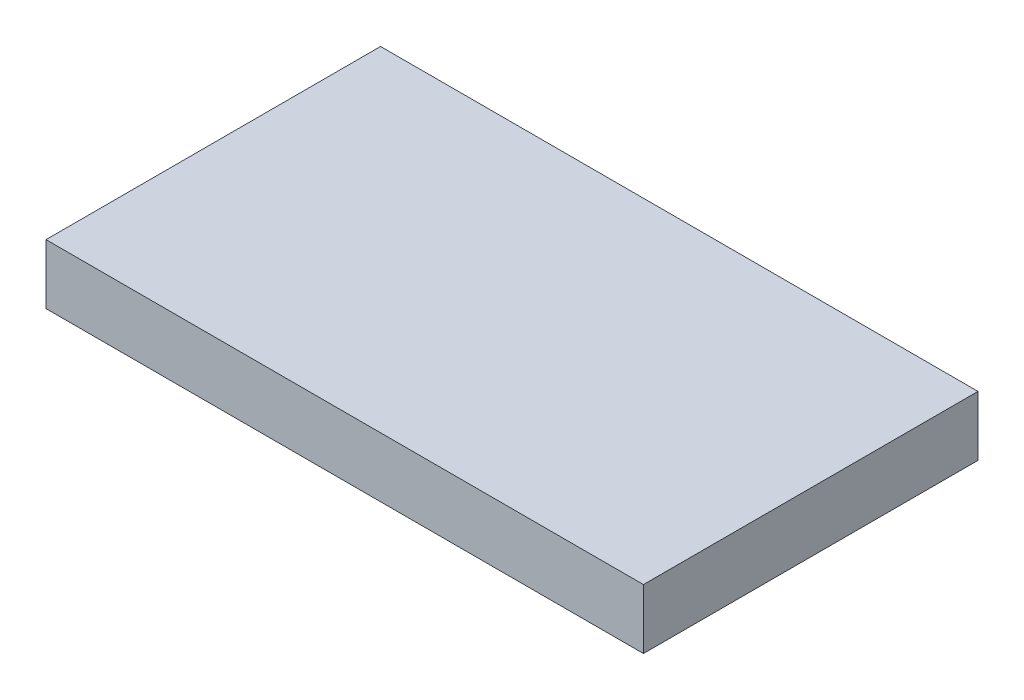
ISO-10303-21;
HEADER;
FILE_DESCRIPTION(('STEP AP214'),'2;1');
FILE_NAME('part.step','',(''),(''),'','','');
FILE_SCHEMA(('AUTOMOTIVE_DESIGN { 1 0 10303 214 1 1 1 1 }'));
ENDSEC;
DATA;
#1=APPLICATION_CONTEXT('core data for automotive mechanical design processes');
#2=APPLICATION_PROTOCOL_DEFINITION('international standard','automotive_design',2000,#1);
#3=PRODUCT_CONTEXT('',#1,'mechanical');
#4=PRODUCT('Part','Part','',(#3));
#5=PRODUCT_RELATED_PRODUCT_CATEGORY('part','',(#4));
#6=PRODUCT_DEFINITION_FORMATION('','',#4);
#7=PRODUCT_DEFINITION_CONTEXT('part definition',#1,'design');
#8=PRODUCT_DEFINITION('design','',#6,#7);
#9=PRODUCT_DEFINITION_SHAPE('','',#8);
#10=(LENGTH_UNIT() NAMED_UNIT(*) SI_UNIT(.MILLI.,.METRE.));
#11=(NAMED_UNIT(*) PLANE_ANGLE_UNIT() SI_UNIT($,.RADIAN.));
#12=(NAMED_UNIT(*) SI_UNIT($,.STERADIAN.) SOLID_ANGLE_UNIT());
#13=UNCERTAINTY_MEASURE_WITH_UNIT(LENGTH_MEASURE(1.E-05),#10,'distance_accuracy_value','');
#14=(GEOMETRIC_REPRESENTATION_CONTEXT(3) GLOBAL_UNCERTAINTY_ASSIGNED_CONTEXT((#13)) GLOBAL_UNIT_ASSIGNED_CONTEXT((#10,
#11,#12)) REPRESENTATION_CONTEXT('',''));
#15=CARTESIAN_POINT('',(0.,0.,0.));
#16=DIRECTION('',(0.,0.,1.));
#17=DIRECTION('',(1.,0.,0.));
#18=AXIS2_PLACEMENT_3D('',#15,#16,#17);
#19=CARTESIAN_POINT('',(63.5,12.7,35.56));
#20=DIRECTION('',(-1.,0.,0.));
#21=DIRECTION('',(0.,0.,1.));
#22=AXIS2_PLACEMENT_3D('',#19,#20,#21);
#23=PLANE('',#22);
#24=DIRECTION('',(0.,0.,-1.));
#25=VECTOR('',#24,1.);
#26=CARTESIAN_POINT('',(63.5,0.,35.56));
#27=LINE('',#26,#25);
#28=CARTESIAN_POINT('',(63.5,0.,35.56));
#29=VERTEX_POINT('',#28);
#30=CARTESIAN_POINT('',(63.5,0.,-35.56));
#31=VERTEX_POINT('',#30);
#32=EDGE_CURVE('E95',#29,#31,#27,.T.);
#33=ORIENTED_EDGE('',*,*,#32,.T.);
#34=DIRECTION('',(0.,-1.,0.));
#35=VECTOR('',#34,1.);
#36=CARTESIAN_POINT('',(63.5,12.7,-35.56));
#37=LINE('',#36,#35);
#38=CARTESIAN_POINT('',(63.5,12.7,-35.56));
#39=VERTEX_POINT('',#38);
#40=EDGE_CURVE('E11',#39,#31,#37,.T.);
#41=ORIENTED_EDGE('',*,*,#40,.F.);
#42=DIRECTION('',(0.,0.,-1.));
#43=VECTOR('',#42,1.);
#44=CARTESIAN_POINT('',(63.5,12.7,35.56));
#45=LINE('',#44,#43);
#46=CARTESIAN_POINT('',(63.5,12.7,35.56));
#47=VERTEX_POINT('',#46);
#48=EDGE_CURVE('E83',#47,#39,#45,.T.);
#49=ORIENTED_EDGE('',*,*,#48,.F.);
#50=DIRECTION('',(0.,-1.,0.));
#51=VECTOR('',#50,1.);
#52=CARTESIAN_POINT('',(63.5,12.7,35.56));
#53=LINE('',#52,#51);
#54=EDGE_CURVE('E91',#47,#29,#53,.T.);
#55=ORIENTED_EDGE('',*,*,#54,.T.);
#56=EDGE_LOOP('',(#33,#41,#49,#55));
#57=FACE_BOUND('',#56,.T.);
#58=ADVANCED_FACE('F32',(#57),#23,.F.);
#59=CARTESIAN_POINT('',(-63.5,12.7,-35.56));
#60=DIRECTION('',(0.,0.,1.));
#61=DIRECTION('',(1.,0.,0.));
#62=AXIS2_PLACEMENT_3D('',#59,#60,#61);
#63=PLANE('',#62);
#64=DIRECTION('',(-1.,0.,0.));
#65=VECTOR('',#64,1.);
#66=CARTESIAN_POINT('',(-63.5,0.,-35.56));
#67=LINE('',#66,#65);
#68=CARTESIAN_POINT('',(-63.5,0.,-35.56));
#69=VERTEX_POINT('',#68);
#70=EDGE_CURVE('E87',#31,#69,#67,.T.);
#71=ORIENTED_EDGE('',*,*,#70,.T.);
#72=DIRECTION('',(0.,-1.,0.));
#73=VECTOR('',#72,1.);
#74=CARTESIAN_POINT('',(-63.5,12.7,-35.56));
#75=LINE('',#74,#73);
#76=CARTESIAN_POINT('',(-63.5,12.7,-35.56));
#77=VERTEX_POINT('',#76);
#78=EDGE_CURVE('E40',#77,#69,#75,.T.);
#79=ORIENTED_EDGE('',*,*,#78,.F.);
#80=DIRECTION('',(-1.,0.,0.));
#81=VECTOR('',#80,1.);
#82=CARTESIAN_POINT('',(-63.5,12.7,-35.56));
#83=LINE('',#82,#81);
#84=EDGE_CURVE('E78',#39,#77,#83,.T.);
#85=ORIENTED_EDGE('',*,*,#84,.F.);
#86=ORIENTED_EDGE('',*,*,#40,.T.);
#87=EDGE_LOOP('',(#71,#79,#85,#86));
#88=FACE_BOUND('',#87,.T.);
#89=ADVANCED_FACE('F86',(#88),#63,.F.);
#90=CARTESIAN_POINT('',(-63.5,12.7,35.56));
#91=DIRECTION('',(1.,0.,0.));
#92=DIRECTION('',(0.,0.,-1.));
#93=AXIS2_PLACEMENT_3D('',#90,#91,#92);
#94=PLANE('',#93);
#95=DIRECTION('',(0.,0.,1.));
#96=VECTOR('',#95,1.);
#97=CARTESIAN_POINT('',(-63.5,0.,35.56));
#98=LINE('',#97,#96);
#99=CARTESIAN_POINT('',(-63.5,0.,35.56));
#100=VERTEX_POINT('',#99);
#101=EDGE_CURVE('E65',#69,#100,#98,.T.);
#102=ORIENTED_EDGE('',*,*,#101,.T.);
#103=DIRECTION('',(0.,-1.,0.));
#104=VECTOR('',#103,1.);
#105=CARTESIAN_POINT('',(-63.5,12.7,35.56));
#106=LINE('',#105,#104);
#107=CARTESIAN_POINT('',(-63.5,12.7,35.56));
#108=VERTEX_POINT('',#107);
#109=EDGE_CURVE('E88',#108,#100,#106,.T.);
#110=ORIENTED_EDGE('',*,*,#109,.F.);
#111=DIRECTION('',(0.,0.,1.));
#112=VECTOR('',#111,1.);
#113=CARTESIAN_POINT('',(-63.5,12.7,35.56));
#114=LINE('',#113,#112);
#115=EDGE_CURVE('E81',#77,#108,#114,.T.);
#116=ORIENTED_EDGE('',*,*,#115,.F.);
#117=ORIENTED_EDGE('',*,*,#78,.T.);
#118=EDGE_LOOP('',(#102,#110,#116,#117));
#119=FACE_BOUND('',#118,.T.);
#120=ADVANCED_FACE('F89',(#119),#94,.F.);
#121=CARTESIAN_POINT('',(-63.5,12.7,35.56));
#122=DIRECTION('',(0.,0.,-1.));
#123=DIRECTION('',(-1.,0.,0.));
#124=AXIS2_PLACEMENT_3D('',#121,#122,#123);
#125=PLANE('',#124);
#126=DIRECTION('',(1.,0.,0.));
#127=VECTOR('',#126,1.);
#128=CARTESIAN_POINT('',(-63.5,0.,35.56));
#129=LINE('',#128,#127);
#130=EDGE_CURVE('E71',#100,#29,#129,.T.);
#131=ORIENTED_EDGE('',*,*,#130,.T.);
#132=ORIENTED_EDGE('',*,*,#54,.F.);
#133=DIRECTION('',(1.,0.,0.));
#134=VECTOR('',#133,1.);
#135=CARTESIAN_POINT('',(-63.5,12.7,35.56));
#136=LINE('',#135,#134);
#137=EDGE_CURVE('E48',#108,#47,#136,.T.);
#138=ORIENTED_EDGE('',*,*,#137,.F.);
#139=ORIENTED_EDGE('',*,*,#109,.T.);
#140=EDGE_LOOP('',(#131,#132,#138,#139));
#141=FACE_BOUND('',#140,.T.);
#142=ADVANCED_FACE('F102',(#141),#125,.F.);
#143=CARTESIAN_POINT('',(0.,12.7,0.));
#144=DIRECTION('',(0.,-1.,0.));
#145=DIRECTION('',(0.,0.,-1.));
#146=AXIS2_PLACEMENT_3D('',#143,#144,#145);
#147=PLANE('',#146);
#148=ORIENTED_EDGE('',*,*,#48,.T.);
#149=ORIENTED_EDGE('',*,*,#84,.T.);
#150=ORIENTED_EDGE('',*,*,#115,.T.);
#151=ORIENTED_EDGE('',*,*,#137,.T.);
#152=EDGE_LOOP('',(#148,#149,#150,#151));
#153=FACE_BOUND('',#152,.T.);
#154=ADVANCED_FACE('F79',(#153),#147,.F.);
#155=CARTESIAN_POINT('',(0.,0.,0.));
#156=DIRECTION('',(0.,-1.,0.));
#157=DIRECTION('',(0.,0.,-1.));
#158=AXIS2_PLACEMENT_3D('',#155,#156,#157);
#159=PLANE('',#158);
#160=ORIENTED_EDGE('',*,*,#32,.F.);
#161=ORIENTED_EDGE('',*,*,#130,.F.);
#162=ORIENTED_EDGE('',*,*,#101,.F.);
#163=ORIENTED_EDGE('',*,*,#70,.F.);
#164=EDGE_LOOP('',(#160,#161,#162,#163));
#165=FACE_BOUND('',#164,.T.);
#166=ADVANCED_FACE('F105',(#165),#159,.T.);
#167=CLOSED_SHELL('',(#58,#89,#120,#142,#154,#166));
#168=MANIFOLD_SOLID_BREP('B2',#167);
#169=ADVANCED_BREP_SHAPE_REPRESENTATION('',(#18,#168),#14);
#170=SHAPE_DEFINITION_REPRESENTATION(#9,#169);
ENDSEC;
END-ISO-10303-21;
